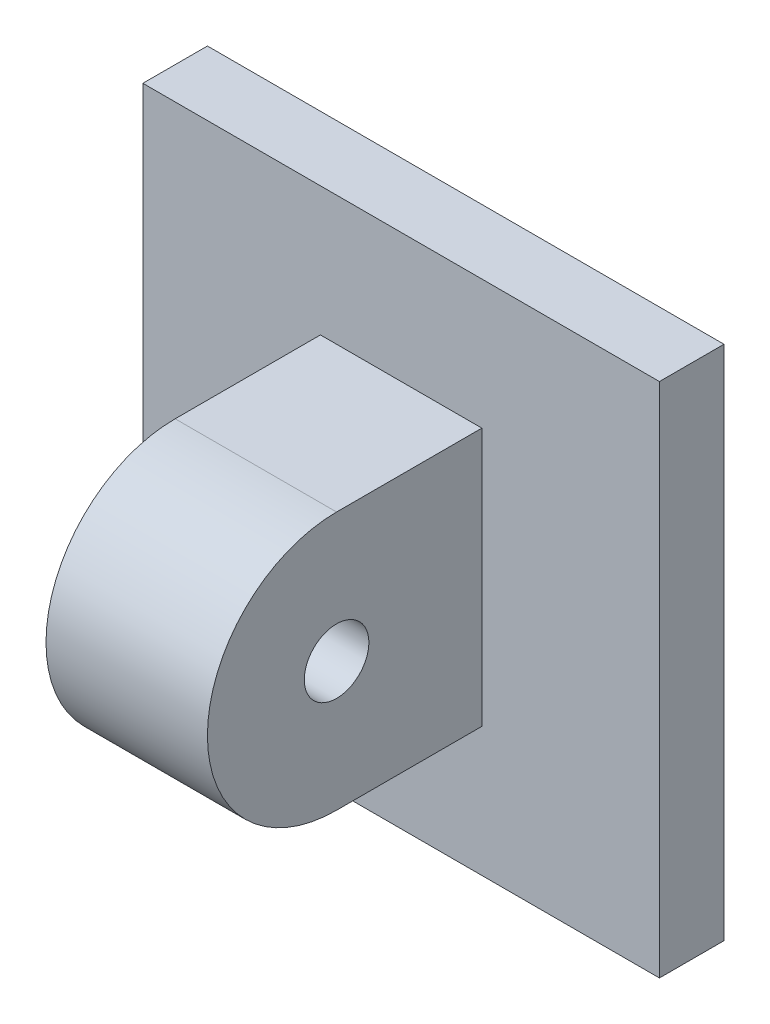
ISO-10303-21;
HEADER;
FILE_DESCRIPTION(('STEP AP214'),'2;1');
FILE_NAME('part.step','',(''),(''),'','','');
FILE_SCHEMA(('AUTOMOTIVE_DESIGN { 1 0 10303 214 1 1 1 1 }'));
ENDSEC;
DATA;
#1=APPLICATION_CONTEXT('core data for automotive mechanical design processes');
#2=APPLICATION_PROTOCOL_DEFINITION('international standard','automotive_design',2000,#1);
#3=PRODUCT_CONTEXT('',#1,'mechanical');
#4=PRODUCT('Part','Part','',(#3));
#5=PRODUCT_RELATED_PRODUCT_CATEGORY('part','',(#4));
#6=PRODUCT_DEFINITION_FORMATION('','',#4);
#7=PRODUCT_DEFINITION_CONTEXT('part definition',#1,'design');
#8=PRODUCT_DEFINITION('design','',#6,#7);
#9=PRODUCT_DEFINITION_SHAPE('','',#8);
#10=(LENGTH_UNIT() NAMED_UNIT(*) SI_UNIT(.MILLI.,.METRE.));
#11=(NAMED_UNIT(*) PLANE_ANGLE_UNIT() SI_UNIT($,.RADIAN.));
#12=(NAMED_UNIT(*) SI_UNIT($,.STERADIAN.) SOLID_ANGLE_UNIT());
#13=UNCERTAINTY_MEASURE_WITH_UNIT(LENGTH_MEASURE(1.E-05),#10,'distance_accuracy_value','');
#14=(GEOMETRIC_REPRESENTATION_CONTEXT(3) GLOBAL_UNCERTAINTY_ASSIGNED_CONTEXT((#13)) GLOBAL_UNIT_ASSIGNED_CONTEXT((#10,
#11,#12)) REPRESENTATION_CONTEXT('',''));
#15=CARTESIAN_POINT('',(0.,0.,0.));
#16=DIRECTION('',(0.,0.,1.));
#17=DIRECTION('',(1.,0.,0.));
#18=AXIS2_PLACEMENT_3D('',#15,#16,#17);
#19=CARTESIAN_POINT('',(0.,0.,2.));
#20=DIRECTION('',(0.,0.,-1.));
#21=DIRECTION('',(-1.,0.,0.));
#22=AXIS2_PLACEMENT_3D('',#19,#20,#21);
#23=PLANE('',#22);
#24=DIRECTION('',(0.,-1.,0.));
#25=VECTOR('',#24,1.);
#26=CARTESIAN_POINT('',(0.,0.,2.));
#27=LINE('',#26,#25);
#28=CARTESIAN_POINT('',(0.,16.,2.));
#29=VERTEX_POINT('',#28);
#30=CARTESIAN_POINT('',(0.,0.,2.));
#31=VERTEX_POINT('',#30);
#32=EDGE_CURVE('E160',#29,#31,#27,.T.);
#33=ORIENTED_EDGE('',*,*,#32,.T.);
#34=DIRECTION('',(1.,0.,0.));
#35=VECTOR('',#34,1.);
#36=CARTESIAN_POINT('',(0.,0.,2.));
#37=LINE('',#36,#35);
#38=CARTESIAN_POINT('',(16.,0.,2.));
#39=VERTEX_POINT('',#38);
#40=EDGE_CURVE('E164',#31,#39,#37,.T.);
#41=ORIENTED_EDGE('',*,*,#40,.T.);
#42=DIRECTION('',(0.,1.,0.));
#43=VECTOR('',#42,1.);
#44=CARTESIAN_POINT('',(16.,0.,2.));
#45=LINE('',#44,#43);
#46=CARTESIAN_POINT('',(16.,16.,2.));
#47=VERTEX_POINT('',#46);
#48=EDGE_CURVE('E168',#39,#47,#45,.T.);
#49=ORIENTED_EDGE('',*,*,#48,.T.);
#50=DIRECTION('',(-1.,0.,0.));
#51=VECTOR('',#50,1.);
#52=CARTESIAN_POINT('',(0.,16.,2.));
#53=LINE('',#52,#51);
#54=EDGE_CURVE('E171',#47,#29,#53,.T.);
#55=ORIENTED_EDGE('',*,*,#54,.T.);
#56=EDGE_LOOP('',(#33,#41,#49,#55));
#57=FACE_BOUND('',#56,.T.);
#58=DIRECTION('',(0.,-1.,0.));
#59=VECTOR('',#58,1.);
#60=CARTESIAN_POINT('',(5.5,12.,2.));
#61=LINE('',#60,#59);
#62=CARTESIAN_POINT('',(5.5,12.,2.));
#63=VERTEX_POINT('',#62);
#64=CARTESIAN_POINT('',(5.5,4.,2.));
#65=VERTEX_POINT('',#64);
#66=EDGE_CURVE('E56',#63,#65,#61,.T.);
#67=ORIENTED_EDGE('',*,*,#66,.F.);
#68=DIRECTION('',(-1.,0.,0.));
#69=VECTOR('',#68,1.);
#70=CARTESIAN_POINT('',(5.5,12.,2.));
#71=LINE('',#70,#69);
#72=CARTESIAN_POINT('',(10.5,12.,2.));
#73=VERTEX_POINT('',#72);
#74=EDGE_CURVE('E60',#73,#63,#71,.T.);
#75=ORIENTED_EDGE('',*,*,#74,.F.);
#76=DIRECTION('',(0.,1.,0.));
#77=VECTOR('',#76,1.);
#78=CARTESIAN_POINT('',(10.5,12.,2.));
#79=LINE('',#78,#77);
#80=CARTESIAN_POINT('',(10.5,4.,2.));
#81=VERTEX_POINT('',#80);
#82=EDGE_CURVE('E147',#81,#73,#79,.T.);
#83=ORIENTED_EDGE('',*,*,#82,.F.);
#84=DIRECTION('',(1.,0.,0.));
#85=VECTOR('',#84,1.);
#86=CARTESIAN_POINT('',(5.5,4.,2.));
#87=LINE('',#86,#85);
#88=EDGE_CURVE('E144',#65,#81,#87,.T.);
#89=ORIENTED_EDGE('',*,*,#88,.F.);
#90=EDGE_LOOP('',(#67,#75,#83,#89));
#91=FACE_BOUND('',#90,.T.);
#92=ADVANCED_FACE('F39',(#57,#91),#23,.F.);
#93=CARTESIAN_POINT('',(0.,0.,2.));
#94=DIRECTION('',(1.,0.,0.));
#95=DIRECTION('',(0.,0.,-1.));
#96=AXIS2_PLACEMENT_3D('',#93,#94,#95);
#97=PLANE('',#96);
#98=DIRECTION('',(0.,-1.,0.));
#99=VECTOR('',#98,1.);
#100=CARTESIAN_POINT('',(0.,0.,0.));
#101=LINE('',#100,#99);
#102=CARTESIAN_POINT('',(0.,16.,0.));
#103=VERTEX_POINT('',#102);
#104=CARTESIAN_POINT('',(0.,0.,0.));
#105=VERTEX_POINT('',#104);
#106=EDGE_CURVE('E113',#103,#105,#101,.T.);
#107=ORIENTED_EDGE('',*,*,#106,.T.);
#108=DIRECTION('',(0.,0.,-1.));
#109=VECTOR('',#108,1.);
#110=CARTESIAN_POINT('',(0.,0.,2.));
#111=LINE('',#110,#109);
#112=EDGE_CURVE('E11',#31,#105,#111,.T.);
#113=ORIENTED_EDGE('',*,*,#112,.F.);
#114=ORIENTED_EDGE('',*,*,#32,.F.);
#115=DIRECTION('',(0.,0.,-1.));
#116=VECTOR('',#115,1.);
#117=CARTESIAN_POINT('',(0.,16.,2.));
#118=LINE('',#117,#116);
#119=EDGE_CURVE('E174',#29,#103,#118,.T.);
#120=ORIENTED_EDGE('',*,*,#119,.T.);
#121=EDGE_LOOP('',(#107,#113,#114,#120));
#122=FACE_BOUND('',#121,.T.);
#123=ADVANCED_FACE('F41',(#122),#97,.F.);
#124=CARTESIAN_POINT('',(0.,0.,2.));
#125=DIRECTION('',(0.,1.,0.));
#126=DIRECTION('',(0.,0.,1.));
#127=AXIS2_PLACEMENT_3D('',#124,#125,#126);
#128=PLANE('',#127);
#129=DIRECTION('',(1.,0.,0.));
#130=VECTOR('',#129,1.);
#131=CARTESIAN_POINT('',(0.,0.,0.));
#132=LINE('',#131,#130);
#133=CARTESIAN_POINT('',(16.,0.,0.));
#134=VERTEX_POINT('',#133);
#135=EDGE_CURVE('E178',#105,#134,#132,.T.);
#136=ORIENTED_EDGE('',*,*,#135,.T.);
#137=DIRECTION('',(0.,0.,-1.));
#138=VECTOR('',#137,1.);
#139=CARTESIAN_POINT('',(16.,0.,2.));
#140=LINE('',#139,#138);
#141=EDGE_CURVE('E49',#39,#134,#140,.T.);
#142=ORIENTED_EDGE('',*,*,#141,.F.);
#143=ORIENTED_EDGE('',*,*,#40,.F.);
#144=ORIENTED_EDGE('',*,*,#112,.T.);
#145=EDGE_LOOP('',(#136,#142,#143,#144));
#146=FACE_BOUND('',#145,.T.);
#147=ADVANCED_FACE('F214',(#146),#128,.F.);
#148=CARTESIAN_POINT('',(16.,0.,2.));
#149=DIRECTION('',(-1.,0.,0.));
#150=DIRECTION('',(0.,0.,1.));
#151=AXIS2_PLACEMENT_3D('',#148,#149,#150);
#152=PLANE('',#151);
#153=DIRECTION('',(0.,1.,0.));
#154=VECTOR('',#153,1.);
#155=CARTESIAN_POINT('',(16.,0.,0.));
#156=LINE('',#155,#154);
#157=CARTESIAN_POINT('',(16.,16.,0.));
#158=VERTEX_POINT('',#157);
#159=EDGE_CURVE('E181',#134,#158,#156,.T.);
#160=ORIENTED_EDGE('',*,*,#159,.T.);
#161=DIRECTION('',(0.,0.,-1.));
#162=VECTOR('',#161,1.);
#163=CARTESIAN_POINT('',(16.,16.,2.));
#164=LINE('',#163,#162);
#165=EDGE_CURVE('E189',#47,#158,#164,.T.);
#166=ORIENTED_EDGE('',*,*,#165,.F.);
#167=ORIENTED_EDGE('',*,*,#48,.F.);
#168=ORIENTED_EDGE('',*,*,#141,.T.);
#169=EDGE_LOOP('',(#160,#166,#167,#168));
#170=FACE_BOUND('',#169,.T.);
#171=ADVANCED_FACE('F199',(#170),#152,.F.);
#172=CARTESIAN_POINT('',(0.,16.,2.));
#173=DIRECTION('',(0.,-1.,0.));
#174=DIRECTION('',(0.,0.,-1.));
#175=AXIS2_PLACEMENT_3D('',#172,#173,#174);
#176=PLANE('',#175);
#177=DIRECTION('',(-1.,0.,0.));
#178=VECTOR('',#177,1.);
#179=CARTESIAN_POINT('',(0.,16.,0.));
#180=LINE('',#179,#178);
#181=EDGE_CURVE('E165',#158,#103,#180,.T.);
#182=ORIENTED_EDGE('',*,*,#181,.T.);
#183=ORIENTED_EDGE('',*,*,#119,.F.);
#184=ORIENTED_EDGE('',*,*,#54,.F.);
#185=ORIENTED_EDGE('',*,*,#165,.T.);
#186=EDGE_LOOP('',(#182,#183,#184,#185));
#187=FACE_BOUND('',#186,.T.);
#188=ADVANCED_FACE('F208',(#187),#176,.F.);
#189=CARTESIAN_POINT('',(0.,0.,0.));
#190=DIRECTION('',(0.,0.,-1.));
#191=DIRECTION('',(-1.,0.,0.));
#192=AXIS2_PLACEMENT_3D('',#189,#190,#191);
#193=PLANE('',#192);
#194=ORIENTED_EDGE('',*,*,#106,.F.);
#195=ORIENTED_EDGE('',*,*,#181,.F.);
#196=ORIENTED_EDGE('',*,*,#159,.F.);
#197=ORIENTED_EDGE('',*,*,#135,.F.);
#198=EDGE_LOOP('',(#194,#195,#196,#197));
#199=FACE_BOUND('',#198,.T.);
#200=ADVANCED_FACE('F205',(#199),#193,.T.);
#201=CARTESIAN_POINT('',(5.5,12.,6.5));
#202=DIRECTION('',(1.,0.,0.));
#203=DIRECTION('',(0.,1.,0.));
#204=AXIS2_PLACEMENT_3D('',#201,#202,#203);
#205=PLANE('',#204);
#206=CARTESIAN_POINT('',(5.5,8.,6.5));
#207=DIRECTION('',(-1.,0.,0.));
#208=DIRECTION('',(0.,-1.,0.));
#209=AXIS2_PLACEMENT_3D('',#206,#207,#208);
#210=CIRCLE('',#209,1.);
#211=CARTESIAN_POINT('',(5.5,7.,6.5));
#212=VERTEX_POINT('',#211);
#213=EDGE_CURVE('E136',#212,#212,#210,.T.);
#214=ORIENTED_EDGE('',*,*,#213,.F.);
#215=EDGE_LOOP('',(#214));
#216=FACE_BOUND('',#215,.T.);
#217=DIRECTION('',(0.,0.,-1.));
#218=VECTOR('',#217,1.);
#219=CARTESIAN_POINT('',(5.5,4.,6.5));
#220=LINE('',#219,#218);
#221=CARTESIAN_POINT('',(5.5,4.,6.5));
#222=VERTEX_POINT('',#221);
#223=EDGE_CURVE('E104',#222,#65,#220,.T.);
#224=ORIENTED_EDGE('',*,*,#223,.F.);
#225=CARTESIAN_POINT('',(5.5,8.,6.5));
#226=DIRECTION('',(-1.,0.,0.));
#227=DIRECTION('',(0.,-1.,0.));
#228=AXIS2_PLACEMENT_3D('',#225,#226,#227);
#229=CIRCLE('',#228,4.);
#230=CARTESIAN_POINT('',(5.5,12.,6.5));
#231=VERTEX_POINT('',#230);
#232=EDGE_CURVE('E109',#222,#231,#229,.T.);
#233=ORIENTED_EDGE('',*,*,#232,.T.);
#234=DIRECTION('',(0.,0.,-1.));
#235=VECTOR('',#234,1.);
#236=CARTESIAN_POINT('',(5.5,12.,6.5));
#237=LINE('',#236,#235);
#238=EDGE_CURVE('E141',#231,#63,#237,.T.);
#239=ORIENTED_EDGE('',*,*,#238,.T.);
#240=ORIENTED_EDGE('',*,*,#66,.T.);
#241=EDGE_LOOP('',(#224,#233,#239,#240));
#242=FACE_BOUND('',#241,.T.);
#243=ADVANCED_FACE('F106',(#216,#242),#205,.F.);
#244=CARTESIAN_POINT('',(5.5,4.,6.5));
#245=DIRECTION('',(0.,1.,0.));
#246=DIRECTION('',(0.,0.,1.));
#247=AXIS2_PLACEMENT_3D('',#244,#245,#246);
#248=PLANE('',#247);
#249=ORIENTED_EDGE('',*,*,#88,.T.);
#250=DIRECTION('',(0.,0.,-1.));
#251=VECTOR('',#250,1.);
#252=CARTESIAN_POINT('',(10.5,4.,6.5));
#253=LINE('',#252,#251);
#254=CARTESIAN_POINT('',(10.5,4.,6.5));
#255=VERTEX_POINT('',#254);
#256=EDGE_CURVE('E114',#255,#81,#253,.T.);
#257=ORIENTED_EDGE('',*,*,#256,.F.);
#258=DIRECTION('',(1.,0.,0.));
#259=VECTOR('',#258,1.);
#260=CARTESIAN_POINT('',(5.5,4.,6.5));
#261=LINE('',#260,#259);
#262=EDGE_CURVE('E117',#222,#255,#261,.T.);
#263=ORIENTED_EDGE('',*,*,#262,.F.);
#264=ORIENTED_EDGE('',*,*,#223,.T.);
#265=EDGE_LOOP('',(#249,#257,#263,#264));
#266=FACE_BOUND('',#265,.T.);
#267=ADVANCED_FACE('F118',(#266),#248,.F.);
#268=CARTESIAN_POINT('',(10.5,12.,6.5));
#269=DIRECTION('',(-1.,0.,0.));
#270=DIRECTION('',(0.,-1.,0.));
#271=AXIS2_PLACEMENT_3D('',#268,#269,#270);
#272=PLANE('',#271);
#273=CARTESIAN_POINT('',(10.5,8.,6.5));
#274=DIRECTION('',(-1.,0.,0.));
#275=DIRECTION('',(0.,-1.,0.));
#276=AXIS2_PLACEMENT_3D('',#273,#274,#275);
#277=CIRCLE('',#276,1.);
#278=CARTESIAN_POINT('',(10.5,7.,6.5));
#279=VERTEX_POINT('',#278);
#280=EDGE_CURVE('E43',#279,#279,#277,.T.);
#281=ORIENTED_EDGE('',*,*,#280,.T.);
#282=EDGE_LOOP('',(#281));
#283=FACE_BOUND('',#282,.T.);
#284=DIRECTION('',(0.,0.,-1.));
#285=VECTOR('',#284,1.);
#286=CARTESIAN_POINT('',(10.5,12.,6.5));
#287=LINE('',#286,#285);
#288=CARTESIAN_POINT('',(10.5,12.,6.5));
#289=VERTEX_POINT('',#288);
#290=EDGE_CURVE('E154',#289,#73,#287,.T.);
#291=ORIENTED_EDGE('',*,*,#290,.F.);
#292=CARTESIAN_POINT('',(10.5,8.,6.5));
#293=DIRECTION('',(-1.,0.,0.));
#294=DIRECTION('',(0.,-1.,0.));
#295=AXIS2_PLACEMENT_3D('',#292,#293,#294);
#296=CIRCLE('',#295,4.);
#297=EDGE_CURVE('E130',#255,#289,#296,.T.);
#298=ORIENTED_EDGE('',*,*,#297,.F.);
#299=ORIENTED_EDGE('',*,*,#256,.T.);
#300=ORIENTED_EDGE('',*,*,#82,.T.);
#301=EDGE_LOOP('',(#291,#298,#299,#300));
#302=FACE_BOUND('',#301,.T.);
#303=ADVANCED_FACE('F253',(#283,#302),#272,.F.);
#304=CARTESIAN_POINT('',(5.5,12.,6.5));
#305=DIRECTION('',(0.,-1.,0.));
#306=DIRECTION('',(0.,0.,-1.));
#307=AXIS2_PLACEMENT_3D('',#304,#305,#306);
#308=PLANE('',#307);
#309=ORIENTED_EDGE('',*,*,#74,.T.);
#310=ORIENTED_EDGE('',*,*,#238,.F.);
#311=DIRECTION('',(-1.,0.,0.));
#312=VECTOR('',#311,1.);
#313=CARTESIAN_POINT('',(5.5,12.,6.5));
#314=LINE('',#313,#312);
#315=EDGE_CURVE('E124',#289,#231,#314,.T.);
#316=ORIENTED_EDGE('',*,*,#315,.F.);
#317=ORIENTED_EDGE('',*,*,#290,.T.);
#318=EDGE_LOOP('',(#309,#310,#316,#317));
#319=FACE_BOUND('',#318,.T.);
#320=ADVANCED_FACE('F259',(#319),#308,.F.);
#321=CARTESIAN_POINT('',(10.5,8.,6.5));
#322=DIRECTION('',(-1.,0.,0.));
#323=DIRECTION('',(0.,-1.,0.));
#324=AXIS2_PLACEMENT_3D('',#321,#322,#323);
#325=CYLINDRICAL_SURFACE('',#324,4.);
#326=ORIENTED_EDGE('',*,*,#297,.T.);
#327=ORIENTED_EDGE('',*,*,#315,.T.);
#328=ORIENTED_EDGE('',*,*,#232,.F.);
#329=ORIENTED_EDGE('',*,*,#262,.T.);
#330=EDGE_LOOP('',(#326,#327,#328,#329));
#331=FACE_BOUND('',#330,.T.);
#332=ADVANCED_FACE('F127',(#331),#325,.T.);
#333=CARTESIAN_POINT('',(15.5,8.,6.5));
#334=DIRECTION('',(-1.,0.,0.));
#335=DIRECTION('',(0.,-1.,0.));
#336=AXIS2_PLACEMENT_3D('',#333,#334,#335);
#337=CYLINDRICAL_SURFACE('',#336,1.);
#338=ORIENTED_EDGE('',*,*,#213,.T.);
#339=EDGE_LOOP('',(#338));
#340=FACE_BOUND('',#339,.T.);
#341=ORIENTED_EDGE('',*,*,#280,.F.);
#342=EDGE_LOOP('',(#341));
#343=FACE_BOUND('',#342,.T.);
#344=ADVANCED_FACE('F273',(#340,#343),#337,.F.);
#345=CLOSED_SHELL('',(#92,#123,#147,#171,#188,#200,#243,#267,#303,#320,#332,#344));
#346=MANIFOLD_SOLID_BREP('B2',#345);
#347=ADVANCED_BREP_SHAPE_REPRESENTATION('',(#18,#346),#14);
#348=SHAPE_DEFINITION_REPRESENTATION(#9,#347);
ENDSEC;
END-ISO-10303-21;
